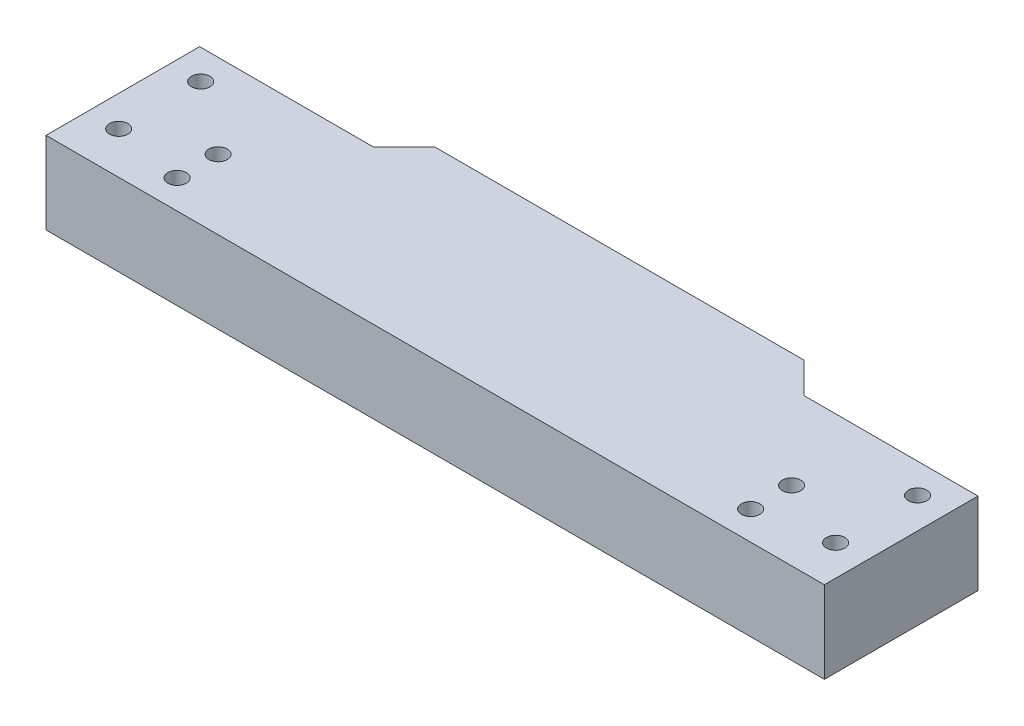
ISO-10303-21;
HEADER;
FILE_DESCRIPTION(('STEP AP214'),'2;1');
FILE_NAME('part.step','',(''),(''),'','','');
FILE_SCHEMA(('AUTOMOTIVE_DESIGN { 1 0 10303 214 1 1 1 1 }'));
ENDSEC;
DATA;
#1=APPLICATION_CONTEXT('core data for automotive mechanical design processes');
#2=APPLICATION_PROTOCOL_DEFINITION('international standard','automotive_design',2000,#1);
#3=PRODUCT_CONTEXT('',#1,'mechanical');
#4=PRODUCT('Part','Part','',(#3));
#5=PRODUCT_RELATED_PRODUCT_CATEGORY('part','',(#4));
#6=PRODUCT_DEFINITION_FORMATION('','',#4);
#7=PRODUCT_DEFINITION_CONTEXT('part definition',#1,'design');
#8=PRODUCT_DEFINITION('design','',#6,#7);
#9=PRODUCT_DEFINITION_SHAPE('','',#8);
#10=(LENGTH_UNIT() NAMED_UNIT(*) SI_UNIT(.MILLI.,.METRE.));
#11=(NAMED_UNIT(*) PLANE_ANGLE_UNIT() SI_UNIT($,.RADIAN.));
#12=(NAMED_UNIT(*) SI_UNIT($,.STERADIAN.) SOLID_ANGLE_UNIT());
#13=UNCERTAINTY_MEASURE_WITH_UNIT(LENGTH_MEASURE(1.E-05),#10,'distance_accuracy_value','');
#14=(GEOMETRIC_REPRESENTATION_CONTEXT(3) GLOBAL_UNCERTAINTY_ASSIGNED_CONTEXT((#13)) GLOBAL_UNIT_ASSIGNED_CONTEXT((#10,
#11,#12)) REPRESENTATION_CONTEXT('',''));
#15=CARTESIAN_POINT('',(0.,0.,0.));
#16=DIRECTION('',(0.,0.,1.));
#17=DIRECTION('',(1.,0.,0.));
#18=AXIS2_PLACEMENT_3D('',#15,#16,#17);
#19=CARTESIAN_POINT('',(-190.,40.,0.));
#20=DIRECTION('',(-1.,0.,0.));
#21=DIRECTION('',(0.,0.,1.));
#22=AXIS2_PLACEMENT_3D('',#19,#20,#21);
#23=PLANE('',#22);
#24=DIRECTION('',(0.,0.,-1.));
#25=VECTOR('',#24,1.);
#26=CARTESIAN_POINT('',(-190.,0.,0.));
#27=LINE('',#26,#25);
#28=CARTESIAN_POINT('',(-190.,0.,0.));
#29=VERTEX_POINT('',#28);
#30=CARTESIAN_POINT('',(-190.,0.,-75.));
#31=VERTEX_POINT('',#30);
#32=EDGE_CURVE('E156',#29,#31,#27,.T.);
#33=ORIENTED_EDGE('',*,*,#32,.F.);
#34=DIRECTION('',(0.,-1.,0.));
#35=VECTOR('',#34,1.);
#36=CARTESIAN_POINT('',(-190.,40.,0.));
#37=LINE('',#36,#35);
#38=CARTESIAN_POINT('',(-190.,40.,0.));
#39=VERTEX_POINT('',#38);
#40=EDGE_CURVE('E11',#39,#29,#37,.T.);
#41=ORIENTED_EDGE('',*,*,#40,.F.);
#42=DIRECTION('',(0.,0.,-1.));
#43=VECTOR('',#42,1.);
#44=CARTESIAN_POINT('',(-190.,40.,0.));
#45=LINE('',#44,#43);
#46=CARTESIAN_POINT('',(-190.,40.,-75.));
#47=VERTEX_POINT('',#46);
#48=EDGE_CURVE('E401',#39,#47,#45,.T.);
#49=ORIENTED_EDGE('',*,*,#48,.T.);
#50=DIRECTION('',(0.,-1.,0.));
#51=VECTOR('',#50,1.);
#52=CARTESIAN_POINT('',(-190.,40.,-75.));
#53=LINE('',#52,#51);
#54=EDGE_CURVE('E54',#47,#31,#53,.T.);
#55=ORIENTED_EDGE('',*,*,#54,.T.);
#56=EDGE_LOOP('',(#33,#41,#49,#55));
#57=FACE_BOUND('',#56,.T.);
#58=ADVANCED_FACE('F37',(#57),#23,.T.);
#59=CARTESIAN_POINT('',(0.,40.,0.));
#60=DIRECTION('',(0.,0.,-1.));
#61=DIRECTION('',(-1.,0.,0.));
#62=AXIS2_PLACEMENT_3D('',#59,#60,#61);
#63=PLANE('',#62);
#64=DIRECTION('',(1.,0.,0.));
#65=VECTOR('',#64,1.);
#66=CARTESIAN_POINT('',(0.,0.,0.));
#67=LINE('',#66,#65);
#68=CARTESIAN_POINT('',(190.,0.,0.));
#69=VERTEX_POINT('',#68);
#70=EDGE_CURVE('E158',#29,#69,#67,.T.);
#71=ORIENTED_EDGE('',*,*,#70,.T.);
#72=DIRECTION('',(0.,-1.,0.));
#73=VECTOR('',#72,1.);
#74=CARTESIAN_POINT('',(190.,40.,0.));
#75=LINE('',#74,#73);
#76=CARTESIAN_POINT('',(190.,40.,0.));
#77=VERTEX_POINT('',#76);
#78=EDGE_CURVE('E46',#77,#69,#75,.T.);
#79=ORIENTED_EDGE('',*,*,#78,.F.);
#80=DIRECTION('',(1.,0.,0.));
#81=VECTOR('',#80,1.);
#82=CARTESIAN_POINT('',(0.,40.,0.));
#83=LINE('',#82,#81);
#84=EDGE_CURVE('E397',#39,#77,#83,.T.);
#85=ORIENTED_EDGE('',*,*,#84,.F.);
#86=ORIENTED_EDGE('',*,*,#40,.T.);
#87=EDGE_LOOP('',(#71,#79,#85,#86));
#88=FACE_BOUND('',#87,.T.);
#89=ADVANCED_FACE('F213',(#88),#63,.F.);
#90=CARTESIAN_POINT('',(190.,40.,0.));
#91=DIRECTION('',(-1.,0.,0.));
#92=DIRECTION('',(0.,0.,1.));
#93=AXIS2_PLACEMENT_3D('',#90,#91,#92);
#94=PLANE('',#93);
#95=DIRECTION('',(0.,0.,-1.));
#96=VECTOR('',#95,1.);
#97=CARTESIAN_POINT('',(190.,0.,0.));
#98=LINE('',#97,#96);
#99=CARTESIAN_POINT('',(190.,0.,-75.));
#100=VERTEX_POINT('',#99);
#101=EDGE_CURVE('E161',#69,#100,#98,.T.);
#102=ORIENTED_EDGE('',*,*,#101,.T.);
#103=DIRECTION('',(0.,-1.,0.));
#104=VECTOR('',#103,1.);
#105=CARTESIAN_POINT('',(190.,40.,-75.));
#106=LINE('',#105,#104);
#107=CARTESIAN_POINT('',(190.,40.,-75.));
#108=VERTEX_POINT('',#107);
#109=EDGE_CURVE('E201',#108,#100,#106,.T.);
#110=ORIENTED_EDGE('',*,*,#109,.F.);
#111=DIRECTION('',(0.,0.,-1.));
#112=VECTOR('',#111,1.);
#113=CARTESIAN_POINT('',(190.,40.,0.));
#114=LINE('',#113,#112);
#115=EDGE_CURVE('E209',#77,#108,#114,.T.);
#116=ORIENTED_EDGE('',*,*,#115,.F.);
#117=ORIENTED_EDGE('',*,*,#78,.T.);
#118=EDGE_LOOP('',(#102,#110,#116,#117));
#119=FACE_BOUND('',#118,.T.);
#120=ADVANCED_FACE('F206',(#119),#94,.F.);
#121=CARTESIAN_POINT('',(0.,40.,-75.));
#122=DIRECTION('',(0.,0.,1.));
#123=DIRECTION('',(1.,0.,0.));
#124=AXIS2_PLACEMENT_3D('',#121,#122,#123);
#125=PLANE('',#124);
#126=DIRECTION('',(-1.,0.,0.));
#127=VECTOR('',#126,1.);
#128=CARTESIAN_POINT('',(0.,0.,-75.));
#129=LINE('',#128,#127);
#130=CARTESIAN_POINT('',(105.,0.,-75.));
#131=VERTEX_POINT('',#130);
#132=EDGE_CURVE('E164',#100,#131,#129,.T.);
#133=ORIENTED_EDGE('',*,*,#132,.T.);
#134=DIRECTION('',(0.,-1.,0.));
#135=VECTOR('',#134,1.);
#136=CARTESIAN_POINT('',(105.,40.,-75.));
#137=LINE('',#136,#135);
#138=CARTESIAN_POINT('',(105.,40.,-75.));
#139=VERTEX_POINT('',#138);
#140=EDGE_CURVE('E198',#139,#131,#137,.T.);
#141=ORIENTED_EDGE('',*,*,#140,.F.);
#142=DIRECTION('',(-1.,0.,0.));
#143=VECTOR('',#142,1.);
#144=CARTESIAN_POINT('',(0.,40.,-75.));
#145=LINE('',#144,#143);
#146=EDGE_CURVE('E395',#108,#139,#145,.T.);
#147=ORIENTED_EDGE('',*,*,#146,.F.);
#148=ORIENTED_EDGE('',*,*,#109,.T.);
#149=EDGE_LOOP('',(#133,#141,#147,#148));
#150=FACE_BOUND('',#149,.T.);
#151=ADVANCED_FACE('F281',(#150),#125,.F.);
#152=CARTESIAN_POINT('',(90.,40.,-90.));
#153=DIRECTION('',(-0.707106781186548,0.,0.707106781186548));
#154=DIRECTION('',(0.707106781186548,0.,0.707106781186548));
#155=AXIS2_PLACEMENT_3D('',#152,#153,#154);
#156=PLANE('',#155);
#157=DIRECTION('',(-0.707106781186548,0.,-0.707106781186548));
#158=VECTOR('',#157,1.);
#159=CARTESIAN_POINT('',(90.,0.,-90.));
#160=LINE('',#159,#158);
#161=CARTESIAN_POINT('',(90.,0.,-90.));
#162=VERTEX_POINT('',#161);
#163=EDGE_CURVE('E167',#131,#162,#160,.T.);
#164=ORIENTED_EDGE('',*,*,#163,.T.);
#165=DIRECTION('',(0.,-1.,0.));
#166=VECTOR('',#165,1.);
#167=CARTESIAN_POINT('',(90.,40.,-90.));
#168=LINE('',#167,#166);
#169=CARTESIAN_POINT('',(90.,40.,-90.));
#170=VERTEX_POINT('',#169);
#171=EDGE_CURVE('E124',#170,#162,#168,.T.);
#172=ORIENTED_EDGE('',*,*,#171,.F.);
#173=DIRECTION('',(-0.707106781186548,0.,-0.707106781186548));
#174=VECTOR('',#173,1.);
#175=CARTESIAN_POINT('',(90.,40.,-90.));
#176=LINE('',#175,#174);
#177=EDGE_CURVE('E113',#139,#170,#176,.T.);
#178=ORIENTED_EDGE('',*,*,#177,.F.);
#179=ORIENTED_EDGE('',*,*,#140,.T.);
#180=EDGE_LOOP('',(#164,#172,#178,#179));
#181=FACE_BOUND('',#180,.T.);
#182=ADVANCED_FACE('F278',(#181),#156,.F.);
#183=CARTESIAN_POINT('',(0.,40.,-90.));
#184=DIRECTION('',(0.,0.,1.));
#185=DIRECTION('',(1.,0.,0.));
#186=AXIS2_PLACEMENT_3D('',#183,#184,#185);
#187=PLANE('',#186);
#188=DIRECTION('',(-1.,0.,0.));
#189=VECTOR('',#188,1.);
#190=CARTESIAN_POINT('',(0.,0.,-90.));
#191=LINE('',#190,#189);
#192=CARTESIAN_POINT('',(-90.,0.,-90.));
#193=VERTEX_POINT('',#192);
#194=EDGE_CURVE('E121',#162,#193,#191,.T.);
#195=ORIENTED_EDGE('',*,*,#194,.T.);
#196=DIRECTION('',(0.,-1.,0.));
#197=VECTOR('',#196,1.);
#198=CARTESIAN_POINT('',(-90.,40.,-90.));
#199=LINE('',#198,#197);
#200=CARTESIAN_POINT('',(-90.,40.,-90.));
#201=VERTEX_POINT('',#200);
#202=EDGE_CURVE('E119',#201,#193,#199,.T.);
#203=ORIENTED_EDGE('',*,*,#202,.F.);
#204=DIRECTION('',(-1.,0.,0.));
#205=VECTOR('',#204,1.);
#206=CARTESIAN_POINT('',(0.,40.,-90.));
#207=LINE('',#206,#205);
#208=EDGE_CURVE('E104',#170,#201,#207,.T.);
#209=ORIENTED_EDGE('',*,*,#208,.F.);
#210=ORIENTED_EDGE('',*,*,#171,.T.);
#211=EDGE_LOOP('',(#195,#203,#209,#210));
#212=FACE_BOUND('',#211,.T.);
#213=ADVANCED_FACE('F120',(#212),#187,.F.);
#214=CARTESIAN_POINT('',(-90.,40.,-90.));
#215=DIRECTION('',(-0.707106781186548,0.,-0.707106781186548));
#216=DIRECTION('',(-0.707106781186548,0.,0.707106781186548));
#217=AXIS2_PLACEMENT_3D('',#214,#215,#216);
#218=PLANE('',#217);
#219=DIRECTION('',(0.707106781186548,0.,-0.707106781186548));
#220=VECTOR('',#219,1.);
#221=CARTESIAN_POINT('',(-90.,0.,-90.));
#222=LINE('',#221,#220);
#223=CARTESIAN_POINT('',(-105.,0.,-75.));
#224=VERTEX_POINT('',#223);
#225=EDGE_CURVE('E171',#224,#193,#222,.T.);
#226=ORIENTED_EDGE('',*,*,#225,.F.);
#227=DIRECTION('',(0.,-1.,0.));
#228=VECTOR('',#227,1.);
#229=CARTESIAN_POINT('',(-105.,40.,-75.));
#230=LINE('',#229,#228);
#231=CARTESIAN_POINT('',(-105.,40.,-75.));
#232=VERTEX_POINT('',#231);
#233=EDGE_CURVE('E79',#232,#224,#230,.T.);
#234=ORIENTED_EDGE('',*,*,#233,.F.);
#235=DIRECTION('',(0.707106781186548,0.,-0.707106781186548));
#236=VECTOR('',#235,1.);
#237=CARTESIAN_POINT('',(-90.,40.,-90.));
#238=LINE('',#237,#236);
#239=EDGE_CURVE('E111',#232,#201,#238,.T.);
#240=ORIENTED_EDGE('',*,*,#239,.T.);
#241=ORIENTED_EDGE('',*,*,#202,.T.);
#242=EDGE_LOOP('',(#226,#234,#240,#241));
#243=FACE_BOUND('',#242,.T.);
#244=ADVANCED_FACE('F126',(#243),#218,.T.);
#245=CARTESIAN_POINT('',(140.,40.,-34.));
#246=DIRECTION('',(0.,-1.,0.));
#247=DIRECTION('',(0.,0.,-1.));
#248=AXIS2_PLACEMENT_3D('',#245,#246,#247);
#249=CYLINDRICAL_SURFACE('',#248,4.49999999999999);
#250=CARTESIAN_POINT('',(140.,40.,-34.));
#251=DIRECTION('',(0.,1.,0.));
#252=DIRECTION('',(0.,0.,1.));
#253=AXIS2_PLACEMENT_3D('',#250,#251,#252);
#254=CIRCLE('',#253,4.49999999999999);
#255=CARTESIAN_POINT('',(140.,40.,-29.5));
#256=VERTEX_POINT('',#255);
#257=EDGE_CURVE('E144',#256,#256,#254,.T.);
#258=ORIENTED_EDGE('',*,*,#257,.T.);
#259=EDGE_LOOP('',(#258));
#260=FACE_BOUND('',#259,.T.);
#261=CARTESIAN_POINT('',(140.,0.,-34.));
#262=DIRECTION('',(0.,1.,0.));
#263=DIRECTION('',(0.,0.,1.));
#264=AXIS2_PLACEMENT_3D('',#261,#262,#263);
#265=CIRCLE('',#264,4.49999999999999);
#266=CARTESIAN_POINT('',(140.,0.,-29.5));
#267=VERTEX_POINT('',#266);
#268=EDGE_CURVE('E188',#267,#267,#265,.T.);
#269=ORIENTED_EDGE('',*,*,#268,.F.);
#270=EDGE_LOOP('',(#269));
#271=FACE_BOUND('',#270,.T.);
#272=ADVANCED_FACE('F255',(#260,#271),#249,.F.);
#273=CARTESIAN_POINT('',(175.,40.,-20.5));
#274=DIRECTION('',(0.,-1.,0.));
#275=DIRECTION('',(0.,0.,-1.));
#276=AXIS2_PLACEMENT_3D('',#273,#274,#275);
#277=CYLINDRICAL_SURFACE('',#276,4.49999999999999);
#278=CARTESIAN_POINT('',(175.,40.,-20.5));
#279=DIRECTION('',(0.,1.,0.));
#280=DIRECTION('',(0.,0.,1.));
#281=AXIS2_PLACEMENT_3D('',#278,#279,#280);
#282=CIRCLE('',#281,4.49999999999999);
#283=CARTESIAN_POINT('',(175.,40.,-16.));
#284=VERTEX_POINT('',#283);
#285=EDGE_CURVE('E141',#284,#284,#282,.T.);
#286=ORIENTED_EDGE('',*,*,#285,.T.);
#287=EDGE_LOOP('',(#286));
#288=FACE_BOUND('',#287,.T.);
#289=CARTESIAN_POINT('',(175.,0.,-20.5));
#290=DIRECTION('',(0.,1.,0.));
#291=DIRECTION('',(0.,0.,1.));
#292=AXIS2_PLACEMENT_3D('',#289,#290,#291);
#293=CIRCLE('',#292,4.49999999999999);
#294=CARTESIAN_POINT('',(175.,0.,-16.));
#295=VERTEX_POINT('',#294);
#296=EDGE_CURVE('E185',#295,#295,#293,.T.);
#297=ORIENTED_EDGE('',*,*,#296,.F.);
#298=EDGE_LOOP('',(#297));
#299=FACE_BOUND('',#298,.T.);
#300=ADVANCED_FACE('F258',(#288,#299),#277,.F.);
#301=CARTESIAN_POINT('',(175.,40.,-60.5));
#302=DIRECTION('',(0.,-1.,0.));
#303=DIRECTION('',(0.,0.,-1.));
#304=AXIS2_PLACEMENT_3D('',#301,#302,#303);
#305=CYLINDRICAL_SURFACE('',#304,4.49999999999999);
#306=CARTESIAN_POINT('',(175.,40.,-60.5));
#307=DIRECTION('',(0.,1.,0.));
#308=DIRECTION('',(0.,0.,1.));
#309=AXIS2_PLACEMENT_3D('',#306,#307,#308);
#310=CIRCLE('',#309,4.49999999999999);
#311=CARTESIAN_POINT('',(175.,40.,-56.));
#312=VERTEX_POINT('',#311);
#313=EDGE_CURVE('E138',#312,#312,#310,.T.);
#314=ORIENTED_EDGE('',*,*,#313,.T.);
#315=EDGE_LOOP('',(#314));
#316=FACE_BOUND('',#315,.T.);
#317=CARTESIAN_POINT('',(175.,0.,-60.5));
#318=DIRECTION('',(0.,1.,0.));
#319=DIRECTION('',(0.,0.,1.));
#320=AXIS2_PLACEMENT_3D('',#317,#318,#319);
#321=CIRCLE('',#320,4.49999999999999);
#322=CARTESIAN_POINT('',(175.,0.,-56.));
#323=VERTEX_POINT('',#322);
#324=EDGE_CURVE('E182',#323,#323,#321,.T.);
#325=ORIENTED_EDGE('',*,*,#324,.F.);
#326=EDGE_LOOP('',(#325));
#327=FACE_BOUND('',#326,.T.);
#328=ADVANCED_FACE('F262',(#316,#327),#305,.F.);
#329=CARTESIAN_POINT('',(-140.,40.,-14.));
#330=DIRECTION('',(0.,-1.,0.));
#331=DIRECTION('',(0.,0.,-1.));
#332=AXIS2_PLACEMENT_3D('',#329,#330,#331);
#333=CYLINDRICAL_SURFACE('',#332,4.49999999999999);
#334=CARTESIAN_POINT('',(-140.,40.,-14.));
#335=DIRECTION('',(0.,1.,0.));
#336=DIRECTION('',(0.,0.,1.));
#337=AXIS2_PLACEMENT_3D('',#334,#335,#336);
#338=CIRCLE('',#337,4.49999999999999);
#339=CARTESIAN_POINT('',(-140.,40.,-9.50000000000001));
#340=VERTEX_POINT('',#339);
#341=EDGE_CURVE('E135',#340,#340,#338,.F.);
#342=ORIENTED_EDGE('',*,*,#341,.F.);
#343=EDGE_LOOP('',(#342));
#344=FACE_BOUND('',#343,.T.);
#345=CARTESIAN_POINT('',(-140.,0.,-14.));
#346=DIRECTION('',(0.,1.,0.));
#347=DIRECTION('',(0.,0.,1.));
#348=AXIS2_PLACEMENT_3D('',#345,#346,#347);
#349=CIRCLE('',#348,4.49999999999999);
#350=CARTESIAN_POINT('',(-140.,0.,-9.50000000000001));
#351=VERTEX_POINT('',#350);
#352=EDGE_CURVE('E179',#351,#351,#349,.F.);
#353=ORIENTED_EDGE('',*,*,#352,.T.);
#354=EDGE_LOOP('',(#353));
#355=FACE_BOUND('',#354,.T.);
#356=ADVANCED_FACE('F266',(#344,#355),#333,.F.);
#357=CARTESIAN_POINT('',(-175.,40.,-20.5));
#358=DIRECTION('',(0.,-1.,0.));
#359=DIRECTION('',(0.,0.,-1.));
#360=AXIS2_PLACEMENT_3D('',#357,#358,#359);
#361=CYLINDRICAL_SURFACE('',#360,4.49999999999999);
#362=CARTESIAN_POINT('',(-175.,40.,-20.5));
#363=DIRECTION('',(0.,1.,0.));
#364=DIRECTION('',(0.,0.,1.));
#365=AXIS2_PLACEMENT_3D('',#362,#363,#364);
#366=CIRCLE('',#365,4.49999999999999);
#367=CARTESIAN_POINT('',(-175.,40.,-16.));
#368=VERTEX_POINT('',#367);
#369=EDGE_CURVE('E129',#368,#368,#366,.F.);
#370=ORIENTED_EDGE('',*,*,#369,.F.);
#371=EDGE_LOOP('',(#370));
#372=FACE_BOUND('',#371,.T.);
#373=CARTESIAN_POINT('',(-175.,0.,-20.5));
#374=DIRECTION('',(0.,1.,0.));
#375=DIRECTION('',(0.,0.,1.));
#376=AXIS2_PLACEMENT_3D('',#373,#374,#375);
#377=CIRCLE('',#376,4.49999999999999);
#378=CARTESIAN_POINT('',(-175.,0.,-16.));
#379=VERTEX_POINT('',#378);
#380=EDGE_CURVE('E176',#379,#379,#377,.F.);
#381=ORIENTED_EDGE('',*,*,#380,.T.);
#382=EDGE_LOOP('',(#381));
#383=FACE_BOUND('',#382,.T.);
#384=ADVANCED_FACE('F234',(#372,#383),#361,.F.);
#385=CARTESIAN_POINT('',(0.,40.,-75.));
#386=DIRECTION('',(0.,0.,-1.));
#387=DIRECTION('',(-1.,0.,0.));
#388=AXIS2_PLACEMENT_3D('',#385,#386,#387);
#389=PLANE('',#388);
#390=DIRECTION('',(1.,0.,0.));
#391=VECTOR('',#390,1.);
#392=CARTESIAN_POINT('',(0.,0.,-75.));
#393=LINE('',#392,#391);
#394=EDGE_CURVE('E173',#31,#224,#393,.T.);
#395=ORIENTED_EDGE('',*,*,#394,.F.);
#396=ORIENTED_EDGE('',*,*,#54,.F.);
#397=DIRECTION('',(1.,0.,0.));
#398=VECTOR('',#397,1.);
#399=CARTESIAN_POINT('',(0.,40.,-75.));
#400=LINE('',#399,#398);
#401=EDGE_CURVE('E127',#47,#232,#400,.T.);
#402=ORIENTED_EDGE('',*,*,#401,.T.);
#403=ORIENTED_EDGE('',*,*,#233,.T.);
#404=EDGE_LOOP('',(#395,#396,#402,#403));
#405=FACE_BOUND('',#404,.T.);
#406=ADVANCED_FACE('F226',(#405),#389,.T.);
#407=CARTESIAN_POINT('',(-175.,40.,-60.5));
#408=DIRECTION('',(0.,-1.,0.));
#409=DIRECTION('',(0.,0.,-1.));
#410=AXIS2_PLACEMENT_3D('',#407,#408,#409);
#411=CYLINDRICAL_SURFACE('',#410,4.49999999999999);
#412=CARTESIAN_POINT('',(-175.,40.,-60.5));
#413=DIRECTION('',(0.,1.,0.));
#414=DIRECTION('',(0.,0.,1.));
#415=AXIS2_PLACEMENT_3D('',#412,#413,#414);
#416=CIRCLE('',#415,4.49999999999999);
#417=CARTESIAN_POINT('',(-175.,40.,-56.));
#418=VERTEX_POINT('',#417);
#419=EDGE_CURVE('E239',#418,#418,#416,.F.);
#420=ORIENTED_EDGE('',*,*,#419,.F.);
#421=EDGE_LOOP('',(#420));
#422=FACE_BOUND('',#421,.T.);
#423=CARTESIAN_POINT('',(-175.,0.,-60.5));
#424=DIRECTION('',(0.,1.,0.));
#425=DIRECTION('',(0.,0.,1.));
#426=AXIS2_PLACEMENT_3D('',#423,#424,#425);
#427=CIRCLE('',#426,4.49999999999999);
#428=CARTESIAN_POINT('',(-175.,0.,-56.));
#429=VERTEX_POINT('',#428);
#430=EDGE_CURVE('E153',#429,#429,#427,.F.);
#431=ORIENTED_EDGE('',*,*,#430,.T.);
#432=EDGE_LOOP('',(#431));
#433=FACE_BOUND('',#432,.T.);
#434=ADVANCED_FACE('F224',(#422,#433),#411,.F.);
#435=CARTESIAN_POINT('',(-140.,40.,-34.));
#436=DIRECTION('',(0.,-1.,0.));
#437=DIRECTION('',(0.,0.,-1.));
#438=AXIS2_PLACEMENT_3D('',#435,#436,#437);
#439=CYLINDRICAL_SURFACE('',#438,4.49999999999999);
#440=CARTESIAN_POINT('',(-140.,40.,-34.));
#441=DIRECTION('',(0.,1.,0.));
#442=DIRECTION('',(0.,0.,1.));
#443=AXIS2_PLACEMENT_3D('',#440,#441,#442);
#444=CIRCLE('',#443,4.49999999999999);
#445=CARTESIAN_POINT('',(-140.,40.,-29.5));
#446=VERTEX_POINT('',#445);
#447=EDGE_CURVE('E194',#446,#446,#444,.F.);
#448=ORIENTED_EDGE('',*,*,#447,.F.);
#449=EDGE_LOOP('',(#448));
#450=FACE_BOUND('',#449,.T.);
#451=CARTESIAN_POINT('',(-140.,0.,-34.));
#452=DIRECTION('',(0.,1.,0.));
#453=DIRECTION('',(0.,0.,1.));
#454=AXIS2_PLACEMENT_3D('',#451,#452,#453);
#455=CIRCLE('',#454,4.49999999999999);
#456=CARTESIAN_POINT('',(-140.,0.,-29.5));
#457=VERTEX_POINT('',#456);
#458=EDGE_CURVE('E150',#457,#457,#455,.F.);
#459=ORIENTED_EDGE('',*,*,#458,.T.);
#460=EDGE_LOOP('',(#459));
#461=FACE_BOUND('',#460,.T.);
#462=ADVANCED_FACE('F39',(#450,#461),#439,.F.);
#463=CARTESIAN_POINT('',(140.,40.,-14.));
#464=DIRECTION('',(0.,-1.,0.));
#465=DIRECTION('',(0.,0.,-1.));
#466=AXIS2_PLACEMENT_3D('',#463,#464,#465);
#467=CYLINDRICAL_SURFACE('',#466,4.49999999999999);
#468=CARTESIAN_POINT('',(140.,40.,-14.));
#469=DIRECTION('',(0.,1.,0.));
#470=DIRECTION('',(0.,0.,1.));
#471=AXIS2_PLACEMENT_3D('',#468,#469,#470);
#472=CIRCLE('',#471,4.49999999999999);
#473=CARTESIAN_POINT('',(140.,40.,-9.50000000000001));
#474=VERTEX_POINT('',#473);
#475=EDGE_CURVE('E147',#474,#474,#472,.T.);
#476=ORIENTED_EDGE('',*,*,#475,.T.);
#477=EDGE_LOOP('',(#476));
#478=FACE_BOUND('',#477,.T.);
#479=CARTESIAN_POINT('',(140.,0.,-14.));
#480=DIRECTION('',(0.,1.,0.));
#481=DIRECTION('',(0.,0.,1.));
#482=AXIS2_PLACEMENT_3D('',#479,#480,#481);
#483=CIRCLE('',#482,4.49999999999999);
#484=CARTESIAN_POINT('',(140.,0.,-9.50000000000001));
#485=VERTEX_POINT('',#484);
#486=EDGE_CURVE('E191',#485,#485,#483,.T.);
#487=ORIENTED_EDGE('',*,*,#486,.F.);
#488=EDGE_LOOP('',(#487));
#489=FACE_BOUND('',#488,.T.);
#490=ADVANCED_FACE('F232',(#478,#489),#467,.F.);
#491=CARTESIAN_POINT('',(0.,40.,0.));
#492=DIRECTION('',(0.,1.,0.));
#493=DIRECTION('',(0.,0.,1.));
#494=AXIS2_PLACEMENT_3D('',#491,#492,#493);
#495=PLANE('',#494);
#496=ORIENTED_EDGE('',*,*,#447,.T.);
#497=EDGE_LOOP('',(#496));
#498=FACE_BOUND('',#497,.T.);
#499=ORIENTED_EDGE('',*,*,#419,.T.);
#500=EDGE_LOOP('',(#499));
#501=FACE_BOUND('',#500,.T.);
#502=ORIENTED_EDGE('',*,*,#48,.F.);
#503=ORIENTED_EDGE('',*,*,#84,.T.);
#504=ORIENTED_EDGE('',*,*,#115,.T.);
#505=ORIENTED_EDGE('',*,*,#146,.T.);
#506=ORIENTED_EDGE('',*,*,#177,.T.);
#507=ORIENTED_EDGE('',*,*,#208,.T.);
#508=ORIENTED_EDGE('',*,*,#239,.F.);
#509=ORIENTED_EDGE('',*,*,#401,.F.);
#510=EDGE_LOOP('',(#502,#503,#504,#505,#506,#507,#508,#509));
#511=FACE_BOUND('',#510,.T.);
#512=ORIENTED_EDGE('',*,*,#369,.T.);
#513=EDGE_LOOP('',(#512));
#514=FACE_BOUND('',#513,.T.);
#515=ORIENTED_EDGE('',*,*,#341,.T.);
#516=EDGE_LOOP('',(#515));
#517=FACE_BOUND('',#516,.T.);
#518=ORIENTED_EDGE('',*,*,#313,.F.);
#519=EDGE_LOOP('',(#518));
#520=FACE_BOUND('',#519,.T.);
#521=ORIENTED_EDGE('',*,*,#285,.F.);
#522=EDGE_LOOP('',(#521));
#523=FACE_BOUND('',#522,.T.);
#524=ORIENTED_EDGE('',*,*,#257,.F.);
#525=EDGE_LOOP('',(#524));
#526=FACE_BOUND('',#525,.T.);
#527=ORIENTED_EDGE('',*,*,#475,.F.);
#528=EDGE_LOOP('',(#527));
#529=FACE_BOUND('',#528,.T.);
#530=ADVANCED_FACE('F107',(#498,#501,#511,#514,#517,#520,#523,#526,#529),#495,.T.);
#531=CARTESIAN_POINT('',(0.,0.,0.));
#532=DIRECTION('',(0.,1.,0.));
#533=DIRECTION('',(0.,0.,1.));
#534=AXIS2_PLACEMENT_3D('',#531,#532,#533);
#535=PLANE('',#534);
#536=ORIENTED_EDGE('',*,*,#458,.F.);
#537=EDGE_LOOP('',(#536));
#538=FACE_BOUND('',#537,.T.);
#539=ORIENTED_EDGE('',*,*,#430,.F.);
#540=EDGE_LOOP('',(#539));
#541=FACE_BOUND('',#540,.T.);
#542=ORIENTED_EDGE('',*,*,#32,.T.);
#543=ORIENTED_EDGE('',*,*,#394,.T.);
#544=ORIENTED_EDGE('',*,*,#225,.T.);
#545=ORIENTED_EDGE('',*,*,#194,.F.);
#546=ORIENTED_EDGE('',*,*,#163,.F.);
#547=ORIENTED_EDGE('',*,*,#132,.F.);
#548=ORIENTED_EDGE('',*,*,#101,.F.);
#549=ORIENTED_EDGE('',*,*,#70,.F.);
#550=EDGE_LOOP('',(#542,#543,#544,#545,#546,#547,#548,#549));
#551=FACE_BOUND('',#550,.T.);
#552=ORIENTED_EDGE('',*,*,#380,.F.);
#553=EDGE_LOOP('',(#552));
#554=FACE_BOUND('',#553,.T.);
#555=ORIENTED_EDGE('',*,*,#352,.F.);
#556=EDGE_LOOP('',(#555));
#557=FACE_BOUND('',#556,.T.);
#558=ORIENTED_EDGE('',*,*,#324,.T.);
#559=EDGE_LOOP('',(#558));
#560=FACE_BOUND('',#559,.T.);
#561=ORIENTED_EDGE('',*,*,#296,.T.);
#562=EDGE_LOOP('',(#561));
#563=FACE_BOUND('',#562,.T.);
#564=ORIENTED_EDGE('',*,*,#268,.T.);
#565=EDGE_LOOP('',(#564));
#566=FACE_BOUND('',#565,.T.);
#567=ORIENTED_EDGE('',*,*,#486,.T.);
#568=EDGE_LOOP('',(#567));
#569=FACE_BOUND('',#568,.T.);
#570=ADVANCED_FACE('F215',(#538,#541,#551,#554,#557,#560,#563,#566,#569),#535,.F.);
#571=CLOSED_SHELL('',(#58,#89,#120,#151,#182,#213,#244,#272,#300,#328,#356,#384,#406,#434,#462,
#490,#530,#570));
#572=MANIFOLD_SOLID_BREP('B2',#571);
#573=ADVANCED_BREP_SHAPE_REPRESENTATION('',(#18,#572),#14);
#574=SHAPE_DEFINITION_REPRESENTATION(#9,#573);
ENDSEC;
END-ISO-10303-21;
